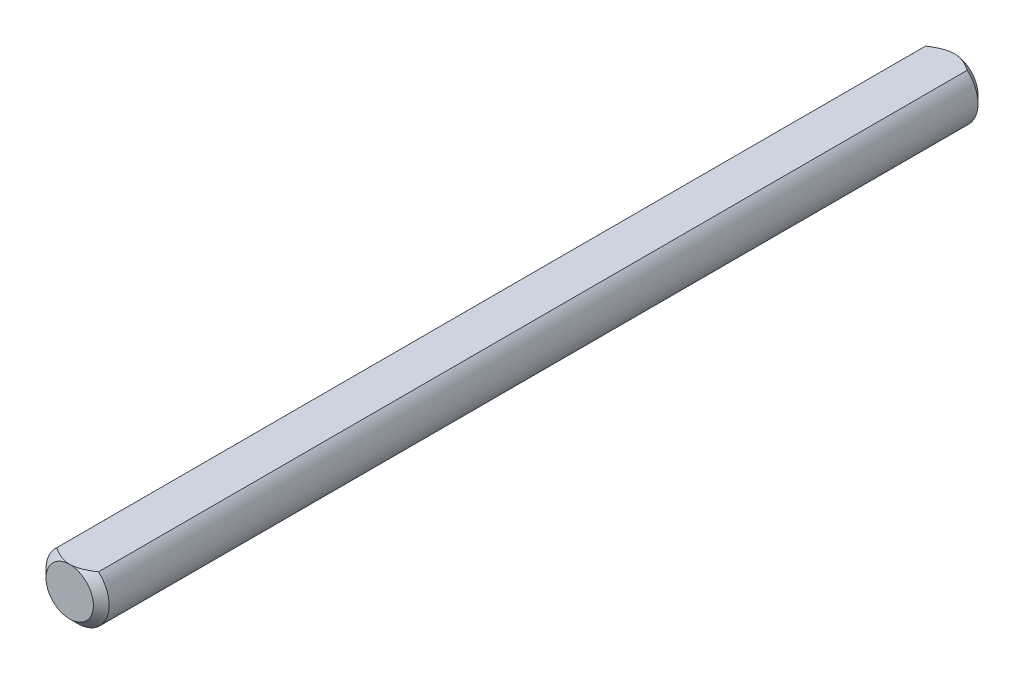
ISO-10303-21;
HEADER;
FILE_DESCRIPTION(('STEP AP214'),'2;1');
FILE_NAME('part.step','',(''),(''),'','','');
FILE_SCHEMA(('AUTOMOTIVE_DESIGN { 1 0 10303 214 1 1 1 1 }'));
ENDSEC;
DATA;
#1=APPLICATION_CONTEXT('core data for automotive mechanical design processes');
#2=APPLICATION_PROTOCOL_DEFINITION('international standard','automotive_design',2000,#1);
#3=PRODUCT_CONTEXT('',#1,'mechanical');
#4=PRODUCT('Part','Part','',(#3));
#5=PRODUCT_RELATED_PRODUCT_CATEGORY('part','',(#4));
#6=PRODUCT_DEFINITION_FORMATION('','',#4);
#7=PRODUCT_DEFINITION_CONTEXT('part definition',#1,'design');
#8=PRODUCT_DEFINITION('design','',#6,#7);
#9=PRODUCT_DEFINITION_SHAPE('','',#8);
#10=(LENGTH_UNIT() NAMED_UNIT(*) SI_UNIT(.MILLI.,.METRE.));
#11=(NAMED_UNIT(*) PLANE_ANGLE_UNIT() SI_UNIT($,.RADIAN.));
#12=(NAMED_UNIT(*) SI_UNIT($,.STERADIAN.) SOLID_ANGLE_UNIT());
#13=UNCERTAINTY_MEASURE_WITH_UNIT(LENGTH_MEASURE(1.E-05),#10,'distance_accuracy_value','');
#14=(GEOMETRIC_REPRESENTATION_CONTEXT(3) GLOBAL_UNCERTAINTY_ASSIGNED_CONTEXT((#13)) GLOBAL_UNIT_ASSIGNED_CONTEXT((#10,
#11,#12)) REPRESENTATION_CONTEXT('',''));
#15=CARTESIAN_POINT('',(0.,0.,0.));
#16=DIRECTION('',(0.,0.,1.));
#17=DIRECTION('',(1.,0.,0.));
#18=AXIS2_PLACEMENT_3D('',#15,#16,#17);
#19=CARTESIAN_POINT('',(0.,0.,28.));
#20=DIRECTION('',(0.,0.,1.));
#21=DIRECTION('',(1.,0.,0.));
#22=AXIS2_PLACEMENT_3D('',#19,#20,#21);
#23=PLANE('',#22);
#24=CARTESIAN_POINT('',(0.,0.,28.0000000000769));
#25=DIRECTION('',(0.,0.,-1.));
#26=DIRECTION('',(-1.,0.,0.));
#27=AXIS2_PLACEMENT_3D('',#24,#25,#26);
#28=CIRCLE('',#27,1.49999999996453);
#29=CARTESIAN_POINT('',(0.,1.49999999998227,28.0000000000591));
#30=VERTEX_POINT('',#29);
#31=EDGE_CURVE('E50',#30,#30,#28,.T.);
#32=ORIENTED_EDGE('',*,*,#31,.F.);
#33=EDGE_LOOP('',(#32));
#34=FACE_BOUND('',#33,.T.);
#35=ADVANCED_FACE('F17',(#34),#23,.T.);
#36=CARTESIAN_POINT('',(2.5,1.5,28.));
#37=DIRECTION('',(0.,-1.,0.));
#38=DIRECTION('',(1.,0.,0.));
#39=AXIS2_PLACEMENT_3D('',#36,#37,#38);
#40=PLANE('',#39);
#41=CARTESIAN_POINT('',(-1.32287565551536,1.49999999999756,-27.4999999999941));
#42=CARTESIAN_POINT('',(-1.28978652610603,1.4999999999991,-27.5218833857488));
#43=CARTESIAN_POINT('',(-1.2564882990866,1.49999999999975,-27.5434496498493));
#44=CARTESIAN_POINT('',(-1.18940821725036,1.50000000000025,-27.5858385594032));
#45=CARTESIAN_POINT('',(-1.15562621828679,1.50000000000009,-27.606660976475));
#46=CARTESIAN_POINT('',(-1.05313237354521,1.49999999999983,-27.6680407619895));
#47=CARTESIAN_POINT('',(-0.983616016068796,1.49999999999995,-27.7072803573646));
#48=CARTESIAN_POINT('',(-0.844330882576817,1.50000000000004,-27.7796887527482));
#49=CARTESIAN_POINT('',(-0.77464416893069,1.50000000000001,-27.8130137248741));
#50=CARTESIAN_POINT('',(-0.632661487178612,1.49999999999999,-27.8733011447095));
#51=CARTESIAN_POINT('',(-0.5603715169712,1.5,-27.900277258548));
#52=CARTESIAN_POINT('',(-0.447711355255238,1.5,-27.9350506591116));
#53=CARTESIAN_POINT('',(-0.408281760393213,1.5,-27.9459074152366));
#54=CARTESIAN_POINT('',(-0.328766084068008,1.5,-27.9648791696476));
#55=CARTESIAN_POINT('',(-0.288680112515106,1.5,-27.9729946221405));
#56=CARTESIAN_POINT('',(-0.20733704073916,1.5,-27.9862763839498));
#57=CARTESIAN_POINT('',(-0.166071526803945,1.5,-27.9913918975323));
#58=CARTESIAN_POINT('',(-0.0832091080286171,1.5,-27.9982691223344));
#59=CARTESIAN_POINT('',(-0.0416118354952966,1.5,-28.0000263648919));
#60=CARTESIAN_POINT('',(-3.40031540642883E-13,1.5,-27.9999999999845));
#61=B_SPLINE_CURVE_WITH_KNOTS('',3,(#41,#42,#43,#44,#45,#46,#47,#48,#49,#50,#51,#52,#53,#54,#55,
#56,#57,#58,#59,#60),.UNSPECIFIED.,.F.,.F.,(4,2,2,2,2,2,2,2,2,4),(0.,0.119008015792543,
0.238052261697434,0.477379838947545,0.708907622242397,0.939932380506152,1.06254219803322,
1.18513169035118,1.30974106782469,1.43451614084029),.UNSPECIFIED.);
#62=CARTESIAN_POINT('',(-1.32287565549662,1.49999999999994,-27.5000000000318));
#63=VERTEX_POINT('',#62);
#64=CARTESIAN_POINT('',(0.,1.49999999998227,-28.0000000000023));
#65=VERTEX_POINT('',#64);
#66=EDGE_CURVE('E72',#63,#65,#61,.T.);
#67=ORIENTED_EDGE('',*,*,#66,.F.);
#68=DIRECTION('',(0.,0.,-1.));
#69=VECTOR('',#68,1.);
#70=CARTESIAN_POINT('',(-1.32287565553244,1.49999999999987,28.));
#71=LINE('',#70,#69);
#72=CARTESIAN_POINT('',(-1.32287565558256,1.49999999999994,27.5000000000082));
#73=VERTEX_POINT('',#72);
#74=EDGE_CURVE('E55',#73,#63,#71,.T.);
#75=ORIENTED_EDGE('',*,*,#74,.F.);
#76=CARTESIAN_POINT('',(0.,1.5,28.0000000000414));
#77=CARTESIAN_POINT('',(-0.0461370153411537,1.5,28.0000386607618));
#78=CARTESIAN_POINT('',(-0.0922502054811632,1.5,27.9978722597983));
#79=CARTESIAN_POINT('',(-0.184012446607621,1.5,27.9894344398407));
#80=CARTESIAN_POINT('',(-0.229662229086198,1.5,27.9831710594502));
#81=CARTESIAN_POINT('',(-0.319483789254834,1.5,27.9669828571545));
#82=CARTESIAN_POINT('',(-0.36366748099446,1.5,27.9571229727273));
#83=CARTESIAN_POINT('',(-0.451194895226763,1.5,27.9341794397866));
#84=CARTESIAN_POINT('',(-0.49453829888904,1.5,27.9210945924852));
#85=CARTESIAN_POINT('',(-0.606395493961297,1.5,27.8833699128924));
#86=CARTESIAN_POINT('',(-0.674171065768609,1.5,27.8565447061907));
#87=CARTESIAN_POINT('',(-0.807413522309719,1.5,27.7975484095209));
#88=CARTESIAN_POINT('',(-0.872876793022831,1.5,27.7653693642392));
#89=CARTESIAN_POINT('',(-1.00366784630742,1.5,27.6960693225684));
#90=CARTESIAN_POINT('',(-1.06893080512456,1.5,27.6588276799467));
#91=CARTESIAN_POINT('',(-1.19733148579122,1.5,27.5813925116897));
#92=CARTESIAN_POINT('',(-1.26047673775407,1.5,27.541211538548));
#93=CARTESIAN_POINT('',(-1.32287565557312,1.5,27.5000000000144));
#94=B_SPLINE_CURVE_WITH_KNOTS('',3,(#76,#77,#78,#79,#80,#81,#82,#83,#84,#85,#86,#87,#88,#89,#90,
#91,#92,#93),.UNSPECIFIED.,.F.,.F.,(4,2,2,2,2,2,2,2,4),(0.,0.13832211529192,0.276373642272287,
0.412046847194123,0.547770561022349,0.766109415085097,0.984775646618904,1.21010028782706,
1.43451329843886),.UNSPECIFIED.);
#95=EDGE_CURVE('E20',#30,#73,#94,.T.);
#96=ORIENTED_EDGE('',*,*,#95,.F.);
#97=CARTESIAN_POINT('',(1.32287565557394,1.50000000000513,27.5000000000172));
#98=CARTESIAN_POINT('',(1.28978652616133,1.50000000000189,27.5218833857714));
#99=CARTESIAN_POINT('',(1.25648829913945,1.50000000000052,27.5434496498727));
#100=CARTESIAN_POINT('',(1.18940821729901,1.49999999999948,27.5858385594294));
#101=CARTESIAN_POINT('',(1.15562621833369,1.49999999999982,27.6066609765031));
#102=CARTESIAN_POINT('',(1.05313237358652,1.50000000000036,27.668040762023));
#103=CARTESIAN_POINT('',(0.983616016105973,1.5000000000001,27.7072803574012));
#104=CARTESIAN_POINT('',(0.844330882605866,1.49999999999991,27.7796887527908));
#105=CARTESIAN_POINT('',(0.77464416895575,1.49999999999998,27.8130137249195));
#106=CARTESIAN_POINT('',(0.632661487195372,1.50000000000002,27.87330114476));
#107=CARTESIAN_POINT('',(0.560371516983649,1.5,27.9002772586007));
#108=CARTESIAN_POINT('',(0.447711355262575,1.5,27.9350506591664));
#109=CARTESIAN_POINT('',(0.408281760399901,1.5,27.9459074152917));
#110=CARTESIAN_POINT('',(0.328766084073361,1.5,27.9648791697034));
#111=CARTESIAN_POINT('',(0.288680112519774,1.5,27.9729946221965));
#112=CARTESIAN_POINT('',(0.207337040742429,1.5,27.9862763840062));
#113=CARTESIAN_POINT('',(0.166071526806498,1.5,27.9913918975889));
#114=CARTESIAN_POINT('',(0.0832091080297293,1.5,27.9982691223912));
#115=CARTESIAN_POINT('',(0.0416118354956832,1.5,28.0000263649488));
#116=CARTESIAN_POINT('',(0.,1.5,28.0000000000414));
#117=B_SPLINE_CURVE_WITH_KNOTS('',3,(#97,#98,#99,#100,#101,#102,#103,#104,#105,#106,#107,#108,
#109,#110,#111,#112,#113,#114,#115,#116),.UNSPECIFIED.,.F.,.F.,(4,2,2,2,2,2,2,2,2,4),(0.,
0.119008015799998,0.238052261712392,0.477379838977855,0.708907622287187,0.939932380565275,
1.0625421980945,1.18513169041462,1.30974106789032,1.43451614090809),.UNSPECIFIED.);
#118=CARTESIAN_POINT('',(1.32287565555233,1.5,27.4999999999949));
#119=VERTEX_POINT('',#118);
#120=EDGE_CURVE('E90',#119,#30,#117,.T.);
#121=ORIENTED_EDGE('',*,*,#120,.F.);
#122=DIRECTION('',(0.,0.,-1.));
#123=VECTOR('',#122,1.);
#124=CARTESIAN_POINT('',(1.3228756555323,1.5,28.));
#125=LINE('',#124,#123);
#126=CARTESIAN_POINT('',(1.32287565549655,1.5,-27.5000000000318));
#127=VERTEX_POINT('',#126);
#128=EDGE_CURVE('E56',#127,#119,#125,.F.);
#129=ORIENTED_EDGE('',*,*,#128,.F.);
#130=CARTESIAN_POINT('',(0.,1.49999999999733,-27.9999999999834));
#131=CARTESIAN_POINT('',(0.0461370153412052,1.49999999999904,-28.0000386607046));
#132=CARTESIAN_POINT('',(0.0922502054812465,1.49999999999974,-27.9978722597413));
#133=CARTESIAN_POINT('',(0.184012446607733,1.50000000000026,-27.9894344397839));
#134=CARTESIAN_POINT('',(0.229662229086308,1.50000000000007,-27.9831710593934));
#135=CARTESIAN_POINT('',(0.31948378925493,1.49999999999993,-27.9669828570976));
#136=CARTESIAN_POINT('',(0.363667480994545,1.49999999999998,-27.9571229726704));
#137=CARTESIAN_POINT('',(0.451194895226832,1.50000000000002,-27.9341794397297));
#138=CARTESIAN_POINT('',(0.494538298889104,1.50000000000001,-27.9210945924283));
#139=CARTESIAN_POINT('',(0.606395493956091,1.49999999999999,-27.8833699128373));
#140=CARTESIAN_POINT('',(0.674171065758321,1.5,-27.8565447061379));
#141=CARTESIAN_POINT('',(0.807413522289589,1.5,-27.7975484094734));
#142=CARTESIAN_POINT('',(0.872876792997941,1.5,-27.7653693641947));
#143=CARTESIAN_POINT('',(1.00366784627299,1.5,-27.6960693225306));
#144=CARTESIAN_POINT('',(1.06893080508537,1.5,-27.6588276799125));
#145=CARTESIAN_POINT('',(1.19733148574278,1.5,-27.581392511663));
#146=CARTESIAN_POINT('',(1.26047673770116,1.5,-27.5412115385252));
#147=CARTESIAN_POINT('',(1.32287565551579,1.5,-27.4999999999955));
#148=B_SPLINE_CURVE_WITH_KNOTS('',3,(#130,#131,#132,#133,#134,#135,#136,#137,#138,#139,#140,
#141,#142,#143,#144,#145,#146,#147),.UNSPECIFIED.,.F.,.F.,(4,2,2,2,2,2,2,2,4),(0.,
0.138322115291976,0.276373642272348,0.412046847194149,0.54777056102236,0.766109415068448,
0.984775646585475,1.21010028777582,1.43451329837009),.UNSPECIFIED.);
#149=EDGE_CURVE('E62',#65,#127,#148,.T.);
#150=ORIENTED_EDGE('',*,*,#149,.F.);
#151=EDGE_LOOP('',(#67,#75,#96,#121,#129,#150));
#152=FACE_BOUND('',#151,.T.);
#153=ADVANCED_FACE('F76',(#152),#40,.F.);
#154=CARTESIAN_POINT('',(0.,0.,-28.));
#155=DIRECTION('',(0.,0.,1.));
#156=DIRECTION('',(1.,0.,0.));
#157=AXIS2_PLACEMENT_3D('',#154,#155,#156);
#158=PLANE('',#157);
#159=CARTESIAN_POINT('',(0.,0.,-28.00000000002));
#160=DIRECTION('',(0.,0.,1.));
#161=DIRECTION('',(1.,0.,0.));
#162=AXIS2_PLACEMENT_3D('',#159,#160,#161);
#163=CIRCLE('',#162,1.49999999996453);
#164=EDGE_CURVE('E59',#65,#65,#163,.T.);
#165=ORIENTED_EDGE('',*,*,#164,.F.);
#166=EDGE_LOOP('',(#165));
#167=FACE_BOUND('',#166,.T.);
#168=ADVANCED_FACE('F88',(#167),#158,.F.);
#169=CARTESIAN_POINT('',(0.,0.,27.5000000000887));
#170=DIRECTION('',(0.,0.,-1.));
#171=DIRECTION('',(-1.,0.,0.));
#172=AXIS2_PLACEMENT_3D('',#169,#170,#171);
#173=CONICAL_SURFACE('',#172,1.99999999995271,0.785398163397448);
#174=ORIENTED_EDGE('',*,*,#31,.T.);
#175=ORIENTED_EDGE('',*,*,#95,.T.);
#176=CARTESIAN_POINT('',(0.,0.,27.5));
#177=DIRECTION('',(0.,0.,-1.));
#178=DIRECTION('',(-1.,0.,0.));
#179=AXIS2_PLACEMENT_3D('',#176,#177,#178);
#180=CIRCLE('',#179,2.);
#181=EDGE_CURVE('E30',#119,#73,#180,.T.);
#182=ORIENTED_EDGE('',*,*,#181,.F.);
#183=ORIENTED_EDGE('',*,*,#120,.T.);
#184=EDGE_LOOP('',(#174,#175,#182,#183));
#185=FACE_BOUND('',#184,.T.);
#186=ADVANCED_FACE('F84',(#185),#173,.T.);
#187=CARTESIAN_POINT('',(0.,0.,-27.5000000000887));
#188=DIRECTION('',(0.,0.,1.));
#189=DIRECTION('',(1.,0.,0.));
#190=AXIS2_PLACEMENT_3D('',#187,#188,#189);
#191=CONICAL_SURFACE('',#190,1.99999999989586,0.785398163397448);
#192=ORIENTED_EDGE('',*,*,#164,.T.);
#193=ORIENTED_EDGE('',*,*,#149,.T.);
#194=CARTESIAN_POINT('',(0.,0.,-27.5));
#195=DIRECTION('',(0.,0.,-1.));
#196=DIRECTION('',(-1.,0.,0.));
#197=AXIS2_PLACEMENT_3D('',#194,#195,#196);
#198=CIRCLE('',#197,2.);
#199=EDGE_CURVE('E10',#63,#127,#198,.F.);
#200=ORIENTED_EDGE('',*,*,#199,.F.);
#201=ORIENTED_EDGE('',*,*,#66,.T.);
#202=EDGE_LOOP('',(#192,#193,#200,#201));
#203=FACE_BOUND('',#202,.T.);
#204=ADVANCED_FACE('F79',(#203),#191,.T.);
#205=CARTESIAN_POINT('',(0.,0.,28.));
#206=DIRECTION('',(0.,0.,-1.));
#207=DIRECTION('',(-1.,0.,0.));
#208=AXIS2_PLACEMENT_3D('',#205,#206,#207);
#209=CYLINDRICAL_SURFACE('',#208,2.);
#210=ORIENTED_EDGE('',*,*,#181,.T.);
#211=ORIENTED_EDGE('',*,*,#74,.T.);
#212=ORIENTED_EDGE('',*,*,#199,.T.);
#213=ORIENTED_EDGE('',*,*,#128,.T.);
#214=EDGE_LOOP('',(#210,#211,#212,#213));
#215=FACE_BOUND('',#214,.T.);
#216=ADVANCED_FACE('F83',(#215),#209,.T.);
#217=CLOSED_SHELL('',(#35,#153,#168,#186,#204,#216));
#218=MANIFOLD_SOLID_BREP('B1',#217);
#219=ADVANCED_BREP_SHAPE_REPRESENTATION('',(#18,#218),#14);
#220=SHAPE_DEFINITION_REPRESENTATION(#9,#219);
ENDSEC;
END-ISO-10303-21;
